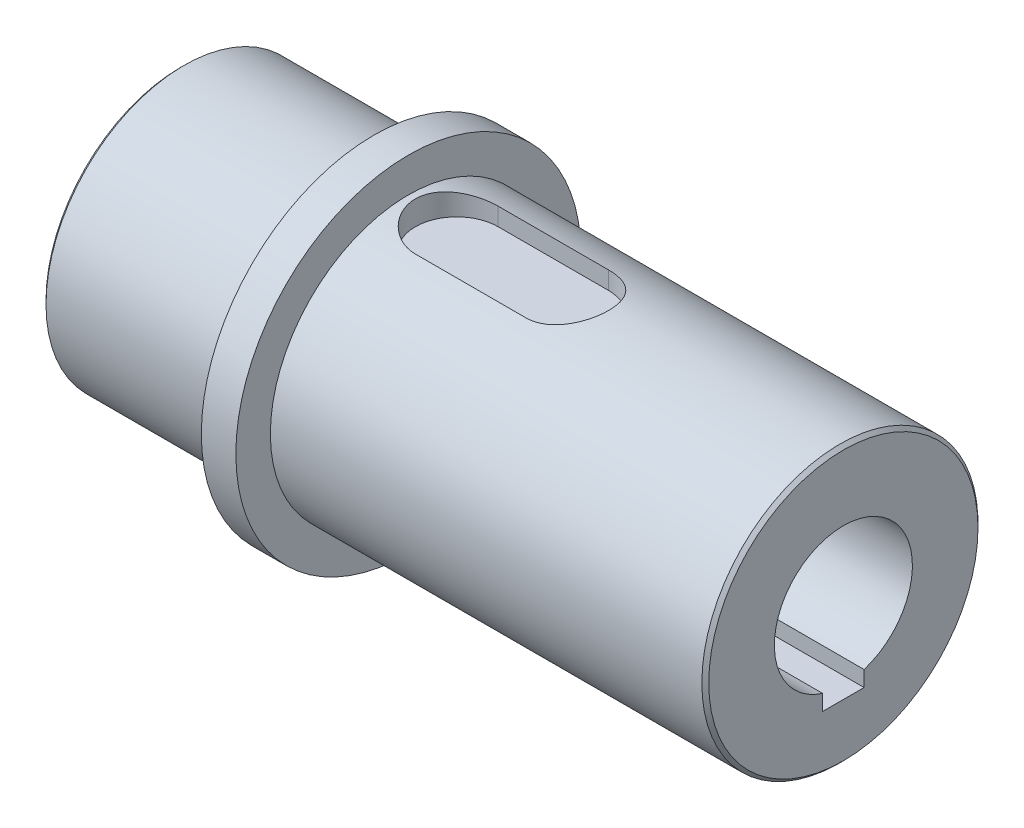
ISO-10303-21;
HEADER;
FILE_DESCRIPTION(('STEP AP214'),'2;1');
FILE_NAME('part.step','',(''),(''),'','','');
FILE_SCHEMA(('AUTOMOTIVE_DESIGN { 1 0 10303 214 1 1 1 1 }'));
ENDSEC;
DATA;
#1=APPLICATION_CONTEXT('core data for automotive mechanical design processes');
#2=APPLICATION_PROTOCOL_DEFINITION('international standard','automotive_design',2000,#1);
#3=PRODUCT_CONTEXT('',#1,'mechanical');
#4=PRODUCT('Part','Part','',(#3));
#5=PRODUCT_RELATED_PRODUCT_CATEGORY('part','',(#4));
#6=PRODUCT_DEFINITION_FORMATION('','',#4);
#7=PRODUCT_DEFINITION_CONTEXT('part definition',#1,'design');
#8=PRODUCT_DEFINITION('design','',#6,#7);
#9=PRODUCT_DEFINITION_SHAPE('','',#8);
#10=(LENGTH_UNIT() NAMED_UNIT(*) SI_UNIT(.MILLI.,.METRE.));
#11=(NAMED_UNIT(*) PLANE_ANGLE_UNIT() SI_UNIT($,.RADIAN.));
#12=(NAMED_UNIT(*) SI_UNIT($,.STERADIAN.) SOLID_ANGLE_UNIT());
#13=UNCERTAINTY_MEASURE_WITH_UNIT(LENGTH_MEASURE(1.E-05),#10,'distance_accuracy_value','');
#14=(GEOMETRIC_REPRESENTATION_CONTEXT(3) GLOBAL_UNCERTAINTY_ASSIGNED_CONTEXT((#13)) GLOBAL_UNIT_ASSIGNED_CONTEXT((#10,
#11,#12)) REPRESENTATION_CONTEXT('',''));
#15=CARTESIAN_POINT('',(0.,0.,0.));
#16=DIRECTION('',(0.,0.,1.));
#17=DIRECTION('',(1.,0.,0.));
#18=AXIS2_PLACEMENT_3D('',#15,#16,#17);
#19=CARTESIAN_POINT('',(96.,0.,0.));
#20=DIRECTION('',(-1.,0.,0.));
#21=DIRECTION('',(0.,0.,1.));
#22=AXIS2_PLACEMENT_3D('',#19,#20,#21);
#23=PLANE('',#22);
#24=CARTESIAN_POINT('',(96.,0.,0.));
#25=DIRECTION('',(-1.,0.,0.));
#26=DIRECTION('',(0.,0.,1.));
#27=AXIS2_PLACEMENT_3D('',#24,#25,#26);
#28=CIRCLE('',#27,10.);
#29=CARTESIAN_POINT('',(96.,-9.53939201416946,3.));
#30=VERTEX_POINT('',#29);
#31=CARTESIAN_POINT('',(96.,-9.53939201416946,-3.));
#32=VERTEX_POINT('',#31);
#33=EDGE_CURVE('E129',#30,#32,#28,.T.);
#34=ORIENTED_EDGE('',*,*,#33,.T.);
#35=DIRECTION('',(0.,-1.,0.));
#36=VECTOR('',#35,1.);
#37=CARTESIAN_POINT('',(96.,-8.71899141751025,-3.));
#38=LINE('',#37,#36);
#39=CARTESIAN_POINT('',(96.,-11.8,-3.));
#40=VERTEX_POINT('',#39);
#41=EDGE_CURVE('E108',#32,#40,#38,.T.);
#42=ORIENTED_EDGE('',*,*,#41,.T.);
#43=DIRECTION('',(0.,0.,1.));
#44=VECTOR('',#43,1.);
#45=CARTESIAN_POINT('',(96.,-11.8,-3.));
#46=LINE('',#45,#44);
#47=CARTESIAN_POINT('',(96.,-11.8,3.));
#48=VERTEX_POINT('',#47);
#49=EDGE_CURVE('E119',#40,#48,#46,.T.);
#50=ORIENTED_EDGE('',*,*,#49,.T.);
#51=DIRECTION('',(0.,1.,0.));
#52=VECTOR('',#51,1.);
#53=CARTESIAN_POINT('',(96.,-8.71899141751025,3.));
#54=LINE('',#53,#52);
#55=EDGE_CURVE('E116',#48,#30,#54,.T.);
#56=ORIENTED_EDGE('',*,*,#55,.T.);
#57=EDGE_LOOP('',(#34,#42,#50,#56));
#58=FACE_BOUND('',#57,.T.);
#59=CARTESIAN_POINT('',(96.,0.,0.));
#60=DIRECTION('',(-1.,0.,0.));
#61=DIRECTION('',(0.,0.,1.));
#62=AXIS2_PLACEMENT_3D('',#59,#60,#61);
#63=CIRCLE('',#62,19.5);
#64=CARTESIAN_POINT('',(96.,0.,19.5));
#65=VERTEX_POINT('',#64);
#66=EDGE_CURVE('E208',#65,#65,#63,.T.);
#67=ORIENTED_EDGE('',*,*,#66,.F.);
#68=EDGE_LOOP('',(#67));
#69=FACE_BOUND('',#68,.T.);
#70=ADVANCED_FACE('F39',(#58,#69),#23,.F.);
#71=CARTESIAN_POINT('',(96.,0.,0.));
#72=DIRECTION('',(-1.,0.,0.));
#73=DIRECTION('',(0.,0.,1.));
#74=AXIS2_PLACEMENT_3D('',#71,#72,#73);
#75=CONICAL_SURFACE('',#74,19.5,0.785398163397448);
#76=CARTESIAN_POINT('',(95.5,0.,0.));
#77=DIRECTION('',(-1.,0.,0.));
#78=DIRECTION('',(0.,0.,1.));
#79=AXIS2_PLACEMENT_3D('',#76,#77,#78);
#80=CIRCLE('',#79,20.);
#81=CARTESIAN_POINT('',(95.5,0.,20.));
#82=VERTEX_POINT('',#81);
#83=EDGE_CURVE('E204',#82,#82,#80,.T.);
#84=ORIENTED_EDGE('',*,*,#83,.F.);
#85=EDGE_LOOP('',(#84));
#86=FACE_BOUND('',#85,.T.);
#87=ORIENTED_EDGE('',*,*,#66,.T.);
#88=EDGE_LOOP('',(#87));
#89=FACE_BOUND('',#88,.T.);
#90=ADVANCED_FACE('F272',(#86,#89),#75,.T.);
#91=CARTESIAN_POINT('',(0.,0.,0.));
#92=DIRECTION('',(-1.,0.,0.));
#93=DIRECTION('',(0.,0.,1.));
#94=AXIS2_PLACEMENT_3D('',#91,#92,#93);
#95=CYLINDRICAL_SURFACE('',#94,20.);
#96=DIRECTION('',(-1.,0.,0.));
#97=VECTOR('',#96,1.);
#98=CARTESIAN_POINT('',(0.,19.0787840283389,-6.));
#99=LINE('',#98,#97);
#100=CARTESIAN_POINT('',(40.,19.0787840283389,-6.));
#101=VERTEX_POINT('',#100);
#102=CARTESIAN_POINT('',(56.,19.0787840283389,-6.));
#103=VERTEX_POINT('',#102);
#104=EDGE_CURVE('E390',#101,#103,#99,.F.);
#105=ORIENTED_EDGE('',*,*,#104,.T.);
#106=CARTESIAN_POINT('',(56.,19.0787840283389,-6.));
#107=CARTESIAN_POINT('',(56.1646679949108,19.0787603919218,-6.00002230630953));
#108=CARTESIAN_POINT('',(56.3293273869304,19.0809150948054,-5.99322212828861));
#109=CARTESIAN_POINT('',(56.6573894283846,19.089408588524,-5.96614198358438));
#110=CARTESIAN_POINT('',(56.8207923520137,19.0957464386677,-5.94586504749983));
#111=CARTESIAN_POINT('',(57.1447667936842,19.1124126760414,-5.89206455668659));
#112=CARTESIAN_POINT('',(57.3053444279638,19.1227309292375,-5.85857463708937));
#113=CARTESIAN_POINT('',(57.6229623086685,19.1470349488515,-5.77865096251378));
#114=CARTESIAN_POINT('',(57.7800024624693,19.1610208111801,-5.73221686903431));
#115=CARTESIAN_POINT('',(58.0893825607235,19.1922338155173,-5.62682620459484));
#116=CARTESIAN_POINT('',(58.2417252187759,19.2094590438083,-5.56787702452553));
#117=CARTESIAN_POINT('',(58.5408741429016,19.2466621419291,-5.43788252899624));
#118=CARTESIAN_POINT('',(58.687678324328,19.2666410353108,-5.36683271334057));
#119=CARTESIAN_POINT('',(58.9747849452531,19.3087849542851,-5.21317247195195));
#120=CARTESIAN_POINT('',(59.1150870185297,19.3309501027959,-5.13056139609833));
#121=CARTESIAN_POINT('',(59.3883877986748,19.3768680311909,-4.95431913401973));
#122=CARTESIAN_POINT('',(59.5213837168722,19.4006214097184,-4.86068378223771));
#123=CARTESIAN_POINT('',(59.7828635732296,19.4497584548899,-4.66024014290223));
#124=CARTESIAN_POINT('',(59.9111151521982,19.4751691904069,-4.5531352636269));
#125=CARTESIAN_POINT('',(60.1582539370087,19.5263015189751,-4.32860344600266));
#126=CARTESIAN_POINT('',(60.2771378666711,19.5520232171847,-4.21117292654718));
#127=CARTESIAN_POINT('',(60.5047413951219,19.6030710031715,-3.96676059198592));
#128=CARTESIAN_POINT('',(60.6134609320288,19.6283970885393,-3.83977871873938));
#129=CARTESIAN_POINT('',(60.8200192544725,19.6779706962222,-3.5770569657621));
#130=CARTESIAN_POINT('',(60.9178581258389,19.7022182270443,-3.44131715512969));
#131=CARTESIAN_POINT('',(61.1039097682599,19.7494715734221,-3.15899953964077));
#132=CARTESIAN_POINT('',(61.1918780463025,19.7724407517412,-3.01225429870654));
#133=CARTESIAN_POINT('',(61.355063794055,19.8159158974823,-2.71155717798052));
#134=CARTESIAN_POINT('',(61.430285978567,19.8364227748921,-2.55760798995096));
#135=CARTESIAN_POINT('',(61.5674164393714,19.8744001644265,-2.24348996032481));
#136=CARTESIAN_POINT('',(61.6293222547682,19.8918701152059,-2.08331997555619));
#137=CARTESIAN_POINT('',(61.7392375024558,19.923254535561,-1.75801430484773));
#138=CARTESIAN_POINT('',(61.7872529399682,19.9371705413066,-1.59288079897389));
#139=CARTESIAN_POINT('',(61.8678255467277,19.960709769643,-1.26354510595574));
#140=CARTESIAN_POINT('',(61.9007806269582,19.9704430293701,-1.09944808925079));
#141=CARTESIAN_POINT('',(61.9528719972864,19.9858966495547,-0.76895215414895));
#142=CARTESIAN_POINT('',(61.9720138041346,19.9916186120195,-0.602554181799297));
#143=CARTESIAN_POINT('',(61.9963199648569,19.9988929276978,-0.268644299740233));
#144=CARTESIAN_POINT('',(62.0014838943061,20.0004451543012,-0.10113235636098));
#145=CARTESIAN_POINT('',(61.9977835949215,19.9993350985708,0.233720900410855));
#146=CARTESIAN_POINT('',(61.9889196235372,19.9966728935831,0.401062216878497));
#147=CARTESIAN_POINT('',(61.9577577883976,19.9873626800314,0.728949940400303));
#148=CARTESIAN_POINT('',(61.9358999900172,19.9808452710305,0.889542117296649));
#149=CARTESIAN_POINT('',(61.8793045182417,19.9641050678088,1.20830021014906));
#150=CARTESIAN_POINT('',(61.8445624577749,19.9538810115069,1.36646528055414));
#151=CARTESIAN_POINT('',(61.7625076983902,19.9300014175933,1.67917461818937));
#152=CARTESIAN_POINT('',(61.7151992242771,19.916347033335,1.83372008335731));
#153=CARTESIAN_POINT('',(61.6083697289368,19.885954581515,2.13828018933734));
#154=CARTESIAN_POINT('',(61.5488441160033,19.8692153547842,2.2882931022387));
#155=CARTESIAN_POINT('',(61.4173094204607,19.8328818557961,2.58443507880941));
#156=CARTESIAN_POINT('',(61.3451671028017,19.8132575095082,2.73050124822119));
#157=CARTESIAN_POINT('',(61.1893768526706,19.7717979578185,3.01609632375419));
#158=CARTESIAN_POINT('',(61.1057249716159,19.7499619943591,3.1556229642424));
#159=CARTESIAN_POINT('',(60.9275130175587,19.704643118031,3.42724384686891));
#160=CARTESIAN_POINT('',(60.8329528185717,19.681160186142,3.55933800314026));
#161=CARTESIAN_POINT('',(60.6335413215712,19.6331439703208,3.81531376455355));
#162=CARTESIAN_POINT('',(60.5286897234991,19.6086106557752,3.93919513006483));
#163=CARTESIAN_POINT('',(60.3051027565368,19.5581593507452,4.18263653591651));
#164=CARTESIAN_POINT('',(60.1859873205257,19.5322244988475,4.30184428600933));
#165=CARTESIAN_POINT('',(59.9381664964976,19.4806179410542,4.52981041510266));
#166=CARTESIAN_POINT('',(59.8094642039191,19.454946153239,4.63857214120815));
#167=CARTESIAN_POINT('',(59.5431596037615,19.4045581786367,4.84504126060965));
#168=CARTESIAN_POINT('',(59.4055514280994,19.3798426394128,4.94274124635232));
#169=CARTESIAN_POINT('',(59.1224409076672,19.3321023379674,5.12628631686323));
#170=CARTESIAN_POINT('',(58.9769416624216,19.3090769201297,5.21213600998877));
#171=CARTESIAN_POINT('',(58.6773648649068,19.2651525602885,5.37223080367566));
#172=CARTESIAN_POINT('',(58.523212921341,19.2442786555291,5.44634371437401));
#173=CARTESIAN_POINT('',(58.2088781586389,19.2055937237889,5.58122691640503));
#174=CARTESIAN_POINT('',(58.0486978375224,19.1877814448102,5.64200266456203));
#175=CARTESIAN_POINT('',(57.7235678816501,19.1557967477957,5.74966145349631));
#176=CARTESIAN_POINT('',(57.5586234734371,19.1416204978023,5.79655912825487));
#177=CARTESIAN_POINT('',(57.225106819549,19.1173543231182,5.87609462586438));
#178=CARTESIAN_POINT('',(57.0565362849515,19.1072625137754,5.90873902604377));
#179=CARTESIAN_POINT('',(56.7400629297635,19.0925703406668,5.95603131732401));
#180=CARTESIAN_POINT('',(56.59245829064,19.0874107715083,5.97251971262425));
#181=CARTESIAN_POINT('',(56.2965728875247,19.0805126306352,5.99450261914156));
#182=CARTESIAN_POINT('',(56.1482934404253,19.0787690288453,6.00001329545508));
#183=CARTESIAN_POINT('',(56.,19.0787840283389,6.));
#184=B_SPLINE_CURVE_WITH_KNOTS('',3,(#106,#107,#108,#109,#110,#111,#112,#113,#114,#115,#116,
#117,#118,#119,#120,#121,#122,#123,#124,#125,#126,#127,#128,#129,#130,#131,#132,#133,#134,#135,
#136,#137,#138,#139,#140,#141,#142,#143,#144,#145,#146,#147,#148,#149,#150,#151,#152,#153,#154,
#155,#156,#157,#158,#159,#160,#161,#162,#163,#164,#165,#166,#167,#168,#169,#170,#171,#172,#173,
#174,#175,#176,#177,#178,#179,#180,#181,#182,#183),.UNSPECIFIED.,.F.,.F.,(4,2,2,2,2,2,2,2,2,2,2,
2,2,2,2,2,2,2,2,2,2,2,2,2,2,2,2,2,2,2,2,2,2,2,2,2,2,2,4),(0.,0.493836284878934,
0.987561555412174,1.48003801924603,1.97252736296405,2.46472666795181,2.95710942192587,
3.44951987503682,3.94211698773,4.44857898474592,4.95521732942466,5.46185875834846,
5.96849619046395,6.48574341264194,7.00279888450885,7.51994982748059,8.03687685551444,
8.53921958328378,9.04136157401788,9.5435188116382,10.0456668334346,10.531706521874,
11.0179118582603,11.5039539397551,11.9901790315928,12.4818885441265,12.9737671698834,
13.4656514771114,13.9575501300996,14.4684682486942,14.9792221093922,15.4903160010787,
16.001210574562,16.517502934493,17.0335836608614,17.549118241575,18.0644146711719,
18.509813123396,18.9545552237083),.UNSPECIFIED.);
#185=CARTESIAN_POINT('',(56.,19.0787840283389,6.));
#186=VERTEX_POINT('',#185);
#187=EDGE_CURVE('E212',#103,#186,#184,.T.);
#188=ORIENTED_EDGE('',*,*,#187,.T.);
#189=DIRECTION('',(-1.,0.,0.));
#190=VECTOR('',#189,1.);
#191=CARTESIAN_POINT('',(0.,19.0787840283389,6.));
#192=LINE('',#191,#190);
#193=CARTESIAN_POINT('',(40.,19.0787840283389,6.));
#194=VERTEX_POINT('',#193);
#195=EDGE_CURVE('E393',#186,#194,#192,.T.);
#196=ORIENTED_EDGE('',*,*,#195,.T.);
#197=CARTESIAN_POINT('',(40.,19.0787840283389,6.));
#198=CARTESIAN_POINT('',(39.8353320050892,19.0787603919218,6.00002230630953));
#199=CARTESIAN_POINT('',(39.6706726130696,19.0809150948054,5.99322212828861));
#200=CARTESIAN_POINT('',(39.3426105716154,19.089408588524,5.96614198358438));
#201=CARTESIAN_POINT('',(39.1792076479863,19.0957464386677,5.94586504749983));
#202=CARTESIAN_POINT('',(38.8552332063158,19.1124126760414,5.89206455668659));
#203=CARTESIAN_POINT('',(38.6946555720362,19.1227309292375,5.85857463708937));
#204=CARTESIAN_POINT('',(38.3770376913315,19.1470349488515,5.77865096251378));
#205=CARTESIAN_POINT('',(38.2199975375307,19.1610208111801,5.73221686903431));
#206=CARTESIAN_POINT('',(37.9106174392765,19.1922338155173,5.62682620459484));
#207=CARTESIAN_POINT('',(37.7582747812241,19.2094590438083,5.56787702452553));
#208=CARTESIAN_POINT('',(37.4591258570984,19.2466621419291,5.43788252899624));
#209=CARTESIAN_POINT('',(37.312321675672,19.2666410353108,5.36683271334057));
#210=CARTESIAN_POINT('',(37.0252150547469,19.3087849542851,5.21317247195195));
#211=CARTESIAN_POINT('',(36.8849129814703,19.3309501027959,5.13056139609832));
#212=CARTESIAN_POINT('',(36.6116122013252,19.3768680311909,4.95431913401973));
#213=CARTESIAN_POINT('',(36.4786162831278,19.4006214097184,4.86068378223771));
#214=CARTESIAN_POINT('',(36.2171364267704,19.4497584548899,4.66024014290223));
#215=CARTESIAN_POINT('',(36.0888848478018,19.4751691904069,4.55313526362689));
#216=CARTESIAN_POINT('',(35.8417460629913,19.5263015189751,4.32860344600266));
#217=CARTESIAN_POINT('',(35.7228621333289,19.5520232171847,4.21117292654718));
#218=CARTESIAN_POINT('',(35.4952586048781,19.6030710031715,3.96676059198591));
#219=CARTESIAN_POINT('',(35.3865390679712,19.6283970885393,3.83977871873938));
#220=CARTESIAN_POINT('',(35.1799807455275,19.6779706962222,3.5770569657621));
#221=CARTESIAN_POINT('',(35.0821418741611,19.7022182270443,3.44131715512969));
#222=CARTESIAN_POINT('',(34.8960902317401,19.7494715734221,3.15899953964077));
#223=CARTESIAN_POINT('',(34.8081219536975,19.7724407517412,3.01225429870653));
#224=CARTESIAN_POINT('',(34.644936205945,19.8159158974823,2.71155717798052));
#225=CARTESIAN_POINT('',(34.569714021433,19.8364227748921,2.55760798995096));
#226=CARTESIAN_POINT('',(34.4325835606286,19.8744001644265,2.24348996032481));
#227=CARTESIAN_POINT('',(34.3706777452318,19.8918701152059,2.08331997555619));
#228=CARTESIAN_POINT('',(34.2607624975442,19.923254535561,1.75801430484773));
#229=CARTESIAN_POINT('',(34.2127470600318,19.9371705413066,1.59288079897389));
#230=CARTESIAN_POINT('',(34.1321744532723,19.960709769643,1.26354510595575));
#231=CARTESIAN_POINT('',(34.0992193730418,19.9704430293701,1.09944808925079));
#232=CARTESIAN_POINT('',(34.0471280027136,19.9858966495547,0.768952154148951));
#233=CARTESIAN_POINT('',(34.0279861958654,19.9916186120195,0.602554181799298));
#234=CARTESIAN_POINT('',(34.0036800351431,19.9988929276978,0.268644299740234));
#235=CARTESIAN_POINT('',(33.9985161056939,20.0004451543012,0.10113235636098));
#236=CARTESIAN_POINT('',(34.0022164050785,19.9993350985708,-0.233720900410854));
#237=CARTESIAN_POINT('',(34.0110803764628,19.9966728935831,-0.401062216878497));
#238=CARTESIAN_POINT('',(34.0422422116024,19.9873626800314,-0.728949940400303));
#239=CARTESIAN_POINT('',(34.0641000099828,19.9808452710305,-0.889542117296649));
#240=CARTESIAN_POINT('',(34.1206954817583,19.9641050678088,-1.20830021014906));
#241=CARTESIAN_POINT('',(34.1554375422251,19.9538810115069,-1.36646528055414));
#242=CARTESIAN_POINT('',(34.2374923016098,19.9300014175933,-1.67917461818937));
#243=CARTESIAN_POINT('',(34.2848007757229,19.916347033335,-1.83372008335731));
#244=CARTESIAN_POINT('',(34.3916302710632,19.885954581515,-2.13828018933734));
#245=CARTESIAN_POINT('',(34.4511558839967,19.8692153547842,-2.2882931022387));
#246=CARTESIAN_POINT('',(34.5826905795393,19.8328818557961,-2.58443507880941));
#247=CARTESIAN_POINT('',(34.6548328971983,19.8132575095082,-2.73050124822119));
#248=CARTESIAN_POINT('',(34.8106231473294,19.7717979578185,-3.01609632375419));
#249=CARTESIAN_POINT('',(34.8942750283841,19.7499619943591,-3.1556229642424));
#250=CARTESIAN_POINT('',(35.0724869824413,19.704643118031,-3.42724384686891));
#251=CARTESIAN_POINT('',(35.1670471814283,19.681160186142,-3.55933800314026));
#252=CARTESIAN_POINT('',(35.3664586784288,19.6331439703208,-3.81531376455355));
#253=CARTESIAN_POINT('',(35.4713102765009,19.6086106557752,-3.93919513006483));
#254=CARTESIAN_POINT('',(35.6948972434632,19.5581593507452,-4.18263653591651));
#255=CARTESIAN_POINT('',(35.8140126794743,19.5322244988475,-4.30184428600933));
#256=CARTESIAN_POINT('',(36.0618335035024,19.4806179410542,-4.52981041510266));
#257=CARTESIAN_POINT('',(36.1905357960809,19.454946153239,-4.63857214120815));
#258=CARTESIAN_POINT('',(36.4568403962385,19.4045581786367,-4.84504126060965));
#259=CARTESIAN_POINT('',(36.5944485719006,19.3798426394128,-4.94274124635232));
#260=CARTESIAN_POINT('',(36.8775590923328,19.3321023379674,-5.12628631686323));
#261=CARTESIAN_POINT('',(37.0230583375784,19.3090769201297,-5.21213600998877));
#262=CARTESIAN_POINT('',(37.3226351350932,19.2651525602885,-5.37223080367566));
#263=CARTESIAN_POINT('',(37.4767870786591,19.2442786555291,-5.44634371437401));
#264=CARTESIAN_POINT('',(37.7911218413611,19.2055937237889,-5.58122691640503));
#265=CARTESIAN_POINT('',(37.9513021624776,19.1877814448102,-5.64200266456203));
#266=CARTESIAN_POINT('',(38.2764321183499,19.1557967477957,-5.74966145349631));
#267=CARTESIAN_POINT('',(38.4413765265628,19.1416204978023,-5.79655912825487));
#268=CARTESIAN_POINT('',(38.774893180451,19.1173543231182,-5.87609462586438));
#269=CARTESIAN_POINT('',(38.9434637150485,19.1072625137754,-5.90873902604377));
#270=CARTESIAN_POINT('',(39.2599370702365,19.0925703406668,-5.95603131732401));
#271=CARTESIAN_POINT('',(39.40754170936,19.0874107715083,-5.97251971262425));
#272=CARTESIAN_POINT('',(39.7034271124753,19.0805126306352,-5.99450261914156));
#273=CARTESIAN_POINT('',(39.8517065595747,19.0787690288453,-6.00001329545508));
#274=CARTESIAN_POINT('',(40.,19.0787840283389,-6.));
#275=B_SPLINE_CURVE_WITH_KNOTS('',3,(#197,#198,#199,#200,#201,#202,#203,#204,#205,#206,#207,
#208,#209,#210,#211,#212,#213,#214,#215,#216,#217,#218,#219,#220,#221,#222,#223,#224,#225,#226,
#227,#228,#229,#230,#231,#232,#233,#234,#235,#236,#237,#238,#239,#240,#241,#242,#243,#244,#245,
#246,#247,#248,#249,#250,#251,#252,#253,#254,#255,#256,#257,#258,#259,#260,#261,#262,#263,#264,
#265,#266,#267,#268,#269,#270,#271,#272,#273,#274),.UNSPECIFIED.,.F.,.F.,(4,2,2,2,2,2,2,2,2,2,2,
2,2,2,2,2,2,2,2,2,2,2,2,2,2,2,2,2,2,2,2,2,2,2,2,2,2,2,4),(0.,0.493836284878934,
0.987561555412174,1.48003801924602,1.97252736296405,2.46472666795181,2.95710942192587,
3.44951987503683,3.94211698773,4.44857898474592,4.95521732942466,5.46185875834846,
5.96849619046395,6.48574341264194,7.00279888450885,7.51994982748059,8.03687685551444,
8.53921958328378,9.04136157401788,9.5435188116382,10.0456668334346,10.531706521874,
11.0179118582603,11.5039539397551,11.9901790315928,12.4818885441265,12.9737671698834,
13.4656514771114,13.9575501300996,14.4684682486942,14.9792221093922,15.4903160010787,
16.001210574562,16.517502934493,17.0335836608614,17.549118241575,18.0644146711719,
18.509813123396,18.9545552237083),.UNSPECIFIED.);
#276=EDGE_CURVE('E62',#194,#101,#275,.T.);
#277=ORIENTED_EDGE('',*,*,#276,.T.);
#278=EDGE_LOOP('',(#105,#188,#196,#277));
#279=FACE_BOUND('',#278,.T.);
#280=CARTESIAN_POINT('',(33.,0.,0.));
#281=DIRECTION('',(-1.,0.,0.));
#282=DIRECTION('',(0.,0.,1.));
#283=AXIS2_PLACEMENT_3D('',#280,#281,#282);
#284=CIRCLE('',#283,20.);
#285=CARTESIAN_POINT('',(33.,0.,20.));
#286=VERTEX_POINT('',#285);
#287=EDGE_CURVE('E200',#286,#286,#284,.T.);
#288=ORIENTED_EDGE('',*,*,#287,.F.);
#289=EDGE_LOOP('',(#288));
#290=FACE_BOUND('',#289,.T.);
#291=ORIENTED_EDGE('',*,*,#83,.T.);
#292=EDGE_LOOP('',(#291));
#293=FACE_BOUND('',#292,.T.);
#294=ADVANCED_FACE('F228',(#279,#290,#293),#95,.T.);
#295=CARTESIAN_POINT('',(33.,0.,-20.));
#296=DIRECTION('',(-1.,0.,0.));
#297=DIRECTION('',(0.,0.,1.));
#298=AXIS2_PLACEMENT_3D('',#295,#296,#297);
#299=PLANE('',#298);
#300=CARTESIAN_POINT('',(33.,0.,0.));
#301=DIRECTION('',(-1.,0.,0.));
#302=DIRECTION('',(0.,0.,1.));
#303=AXIS2_PLACEMENT_3D('',#300,#301,#302);
#304=CIRCLE('',#303,25.);
#305=CARTESIAN_POINT('',(33.,0.,25.));
#306=VERTEX_POINT('',#305);
#307=EDGE_CURVE('E196',#306,#306,#304,.T.);
#308=ORIENTED_EDGE('',*,*,#307,.F.);
#309=EDGE_LOOP('',(#308));
#310=FACE_BOUND('',#309,.T.);
#311=ORIENTED_EDGE('',*,*,#287,.T.);
#312=EDGE_LOOP('',(#311));
#313=FACE_BOUND('',#312,.T.);
#314=ADVANCED_FACE('F265',(#310,#313),#299,.F.);
#315=CARTESIAN_POINT('',(0.,0.,0.));
#316=DIRECTION('',(-1.,0.,0.));
#317=DIRECTION('',(0.,0.,1.));
#318=AXIS2_PLACEMENT_3D('',#315,#316,#317);
#319=CYLINDRICAL_SURFACE('',#318,25.);
#320=CARTESIAN_POINT('',(28.,0.,0.));
#321=DIRECTION('',(-1.,0.,0.));
#322=DIRECTION('',(0.,0.,1.));
#323=AXIS2_PLACEMENT_3D('',#320,#321,#322);
#324=CIRCLE('',#323,25.);
#325=CARTESIAN_POINT('',(28.,0.,25.));
#326=VERTEX_POINT('',#325);
#327=EDGE_CURVE('E192',#326,#326,#324,.T.);
#328=ORIENTED_EDGE('',*,*,#327,.F.);
#329=EDGE_LOOP('',(#328));
#330=FACE_BOUND('',#329,.T.);
#331=ORIENTED_EDGE('',*,*,#307,.T.);
#332=EDGE_LOOP('',(#331));
#333=FACE_BOUND('',#332,.T.);
#334=ADVANCED_FACE('F262',(#330,#333),#319,.T.);
#335=CARTESIAN_POINT('',(28.,0.,-25.));
#336=DIRECTION('',(1.,0.,0.));
#337=DIRECTION('',(0.,0.,-1.));
#338=AXIS2_PLACEMENT_3D('',#335,#336,#337);
#339=PLANE('',#338);
#340=CARTESIAN_POINT('',(28.,0.,0.));
#341=DIRECTION('',(-1.,0.,0.));
#342=DIRECTION('',(0.,0.,1.));
#343=AXIS2_PLACEMENT_3D('',#340,#341,#342);
#344=CIRCLE('',#343,20.);
#345=CARTESIAN_POINT('',(28.,0.,20.));
#346=VERTEX_POINT('',#345);
#347=EDGE_CURVE('E188',#346,#346,#344,.T.);
#348=ORIENTED_EDGE('',*,*,#347,.F.);
#349=EDGE_LOOP('',(#348));
#350=FACE_BOUND('',#349,.T.);
#351=ORIENTED_EDGE('',*,*,#327,.T.);
#352=EDGE_LOOP('',(#351));
#353=FACE_BOUND('',#352,.T.);
#354=ADVANCED_FACE('F258',(#350,#353),#339,.F.);
#355=CARTESIAN_POINT('',(0.,0.,0.));
#356=DIRECTION('',(-1.,0.,0.));
#357=DIRECTION('',(0.,0.,1.));
#358=AXIS2_PLACEMENT_3D('',#355,#356,#357);
#359=CYLINDRICAL_SURFACE('',#358,20.);
#360=CARTESIAN_POINT('',(0.500000000000001,0.,0.));
#361=DIRECTION('',(-1.,0.,0.));
#362=DIRECTION('',(0.,0.,1.));
#363=AXIS2_PLACEMENT_3D('',#360,#361,#362);
#364=CIRCLE('',#363,20.);
#365=CARTESIAN_POINT('',(0.500000000000001,0.,20.));
#366=VERTEX_POINT('',#365);
#367=EDGE_CURVE('E184',#366,#366,#364,.T.);
#368=ORIENTED_EDGE('',*,*,#367,.F.);
#369=EDGE_LOOP('',(#368));
#370=FACE_BOUND('',#369,.T.);
#371=ORIENTED_EDGE('',*,*,#347,.T.);
#372=EDGE_LOOP('',(#371));
#373=FACE_BOUND('',#372,.T.);
#374=ADVANCED_FACE('F254',(#370,#373),#359,.T.);
#375=CARTESIAN_POINT('',(0.500000000000001,0.,0.));
#376=DIRECTION('',(1.,0.,0.));
#377=DIRECTION('',(0.,0.,-1.));
#378=AXIS2_PLACEMENT_3D('',#375,#376,#377);
#379=CONICAL_SURFACE('',#378,20.,0.785398163397449);
#380=CARTESIAN_POINT('',(0.,0.,0.));
#381=DIRECTION('',(-1.,0.,0.));
#382=DIRECTION('',(0.,0.,1.));
#383=AXIS2_PLACEMENT_3D('',#380,#381,#382);
#384=CIRCLE('',#383,19.5);
#385=CARTESIAN_POINT('',(0.,0.,19.5));
#386=VERTEX_POINT('',#385);
#387=EDGE_CURVE('E170',#386,#386,#384,.T.);
#388=ORIENTED_EDGE('',*,*,#387,.F.);
#389=EDGE_LOOP('',(#388));
#390=FACE_BOUND('',#389,.T.);
#391=ORIENTED_EDGE('',*,*,#367,.T.);
#392=EDGE_LOOP('',(#391));
#393=FACE_BOUND('',#392,.T.);
#394=ADVANCED_FACE('F250',(#390,#393),#379,.T.);
#395=CARTESIAN_POINT('',(0.,0.,-19.5));
#396=DIRECTION('',(1.,0.,0.));
#397=DIRECTION('',(0.,0.,-1.));
#398=AXIS2_PLACEMENT_3D('',#395,#396,#397);
#399=PLANE('',#398);
#400=DIRECTION('',(0.,0.,1.));
#401=VECTOR('',#400,1.);
#402=CARTESIAN_POINT('',(0.,-11.8,-3.));
#403=LINE('',#402,#401);
#404=CARTESIAN_POINT('',(0.,-11.8,-3.));
#405=VERTEX_POINT('',#404);
#406=CARTESIAN_POINT('',(0.,-11.8,3.));
#407=VERTEX_POINT('',#406);
#408=EDGE_CURVE('E133',#405,#407,#403,.T.);
#409=ORIENTED_EDGE('',*,*,#408,.F.);
#410=DIRECTION('',(0.,-1.,0.));
#411=VECTOR('',#410,1.);
#412=CARTESIAN_POINT('',(0.,-8.71899141751025,-3.));
#413=LINE('',#412,#411);
#414=CARTESIAN_POINT('',(0.,-9.53939201416946,-3.));
#415=VERTEX_POINT('',#414);
#416=EDGE_CURVE('E110',#415,#405,#413,.T.);
#417=ORIENTED_EDGE('',*,*,#416,.F.);
#418=CARTESIAN_POINT('',(0.,0.,0.));
#419=DIRECTION('',(-1.,0.,0.));
#420=DIRECTION('',(0.,0.,1.));
#421=AXIS2_PLACEMENT_3D('',#418,#419,#420);
#422=CIRCLE('',#421,10.);
#423=CARTESIAN_POINT('',(0.,-9.53939201416946,3.));
#424=VERTEX_POINT('',#423);
#425=EDGE_CURVE('E143',#424,#415,#422,.T.);
#426=ORIENTED_EDGE('',*,*,#425,.F.);
#427=DIRECTION('',(0.,1.,0.));
#428=VECTOR('',#427,1.);
#429=CARTESIAN_POINT('',(0.,-8.71899141751025,3.));
#430=LINE('',#429,#428);
#431=EDGE_CURVE('E54',#407,#424,#430,.T.);
#432=ORIENTED_EDGE('',*,*,#431,.F.);
#433=EDGE_LOOP('',(#409,#417,#426,#432));
#434=FACE_BOUND('',#433,.T.);
#435=ORIENTED_EDGE('',*,*,#387,.T.);
#436=EDGE_LOOP('',(#435));
#437=FACE_BOUND('',#436,.T.);
#438=ADVANCED_FACE('F247',(#434,#437),#399,.F.);
#439=CARTESIAN_POINT('',(40.,16.5,0.));
#440=DIRECTION('',(0.,1.,0.));
#441=DIRECTION('',(0.,0.,1.));
#442=AXIS2_PLACEMENT_3D('',#439,#440,#441);
#443=CYLINDRICAL_SURFACE('',#442,6.);
#444=DIRECTION('',(0.,1.,0.));
#445=VECTOR('',#444,1.);
#446=CARTESIAN_POINT('',(40.,16.5,6.));
#447=LINE('',#446,#445);
#448=CARTESIAN_POINT('',(40.,16.5,6.));
#449=VERTEX_POINT('',#448);
#450=EDGE_CURVE('E166',#449,#194,#447,.T.);
#451=ORIENTED_EDGE('',*,*,#450,.F.);
#452=CARTESIAN_POINT('',(40.,16.5,0.));
#453=DIRECTION('',(0.,1.,0.));
#454=DIRECTION('',(0.,0.,1.));
#455=AXIS2_PLACEMENT_3D('',#452,#453,#454);
#456=CIRCLE('',#455,6.);
#457=CARTESIAN_POINT('',(40.,16.5,-6.));
#458=VERTEX_POINT('',#457);
#459=EDGE_CURVE('E147',#458,#449,#456,.T.);
#460=ORIENTED_EDGE('',*,*,#459,.F.);
#461=DIRECTION('',(0.,1.,0.));
#462=VECTOR('',#461,1.);
#463=CARTESIAN_POINT('',(40.,16.5,-6.));
#464=LINE('',#463,#462);
#465=EDGE_CURVE('E167',#458,#101,#464,.T.);
#466=ORIENTED_EDGE('',*,*,#465,.T.);
#467=ORIENTED_EDGE('',*,*,#276,.F.);
#468=EDGE_LOOP('',(#451,#460,#466,#467));
#469=FACE_BOUND('',#468,.T.);
#470=ADVANCED_FACE('F243',(#469),#443,.F.);
#471=CARTESIAN_POINT('',(40.,16.5,-6.));
#472=DIRECTION('',(0.,0.,-1.));
#473=DIRECTION('',(-1.,0.,0.));
#474=AXIS2_PLACEMENT_3D('',#471,#472,#473);
#475=PLANE('',#474);
#476=ORIENTED_EDGE('',*,*,#465,.F.);
#477=DIRECTION('',(-1.,0.,0.));
#478=VECTOR('',#477,1.);
#479=CARTESIAN_POINT('',(40.,16.5,-6.));
#480=LINE('',#479,#478);
#481=CARTESIAN_POINT('',(56.,16.5,-6.));
#482=VERTEX_POINT('',#481);
#483=EDGE_CURVE('E162',#482,#458,#480,.T.);
#484=ORIENTED_EDGE('',*,*,#483,.F.);
#485=DIRECTION('',(0.,1.,0.));
#486=VECTOR('',#485,1.);
#487=CARTESIAN_POINT('',(56.,16.5,-6.));
#488=LINE('',#487,#486);
#489=EDGE_CURVE('E171',#482,#103,#488,.T.);
#490=ORIENTED_EDGE('',*,*,#489,.T.);
#491=ORIENTED_EDGE('',*,*,#104,.F.);
#492=EDGE_LOOP('',(#476,#484,#490,#491));
#493=FACE_BOUND('',#492,.T.);
#494=ADVANCED_FACE('F237',(#493),#475,.F.);
#495=CARTESIAN_POINT('',(56.,16.5,0.));
#496=DIRECTION('',(0.,1.,0.));
#497=DIRECTION('',(0.,0.,1.));
#498=AXIS2_PLACEMENT_3D('',#495,#496,#497);
#499=CYLINDRICAL_SURFACE('',#498,6.);
#500=ORIENTED_EDGE('',*,*,#489,.F.);
#501=CARTESIAN_POINT('',(56.,16.5,0.));
#502=DIRECTION('',(0.,1.,0.));
#503=DIRECTION('',(0.,0.,1.));
#504=AXIS2_PLACEMENT_3D('',#501,#502,#503);
#505=CIRCLE('',#504,6.);
#506=CARTESIAN_POINT('',(56.,16.5,6.));
#507=VERTEX_POINT('',#506);
#508=EDGE_CURVE('E158',#507,#482,#505,.T.);
#509=ORIENTED_EDGE('',*,*,#508,.F.);
#510=DIRECTION('',(0.,1.,0.));
#511=VECTOR('',#510,1.);
#512=CARTESIAN_POINT('',(56.,16.5,6.));
#513=LINE('',#512,#511);
#514=EDGE_CURVE('E175',#507,#186,#513,.T.);
#515=ORIENTED_EDGE('',*,*,#514,.T.);
#516=ORIENTED_EDGE('',*,*,#187,.F.);
#517=EDGE_LOOP('',(#500,#509,#515,#516));
#518=FACE_BOUND('',#517,.T.);
#519=ADVANCED_FACE('F231',(#518),#499,.F.);
#520=CARTESIAN_POINT('',(40.,16.5,6.));
#521=DIRECTION('',(0.,0.,1.));
#522=DIRECTION('',(1.,0.,0.));
#523=AXIS2_PLACEMENT_3D('',#520,#521,#522);
#524=PLANE('',#523);
#525=ORIENTED_EDGE('',*,*,#514,.F.);
#526=DIRECTION('',(1.,0.,0.));
#527=VECTOR('',#526,1.);
#528=CARTESIAN_POINT('',(40.,16.5,6.));
#529=LINE('',#528,#527);
#530=EDGE_CURVE('E154',#449,#507,#529,.T.);
#531=ORIENTED_EDGE('',*,*,#530,.F.);
#532=ORIENTED_EDGE('',*,*,#450,.T.);
#533=ORIENTED_EDGE('',*,*,#195,.F.);
#534=EDGE_LOOP('',(#525,#531,#532,#533));
#535=FACE_BOUND('',#534,.T.);
#536=ADVANCED_FACE('F236',(#535),#524,.F.);
#537=CARTESIAN_POINT('',(40.,16.5,0.));
#538=DIRECTION('',(0.,1.,0.));
#539=DIRECTION('',(0.,0.,1.));
#540=AXIS2_PLACEMENT_3D('',#537,#538,#539);
#541=PLANE('',#540);
#542=ORIENTED_EDGE('',*,*,#459,.T.);
#543=ORIENTED_EDGE('',*,*,#530,.T.);
#544=ORIENTED_EDGE('',*,*,#508,.T.);
#545=ORIENTED_EDGE('',*,*,#483,.T.);
#546=EDGE_LOOP('',(#542,#543,#544,#545));
#547=FACE_BOUND('',#546,.T.);
#548=ADVANCED_FACE('F241',(#547),#541,.T.);
#549=CARTESIAN_POINT('',(96.,0.,0.));
#550=DIRECTION('',(-1.,0.,0.));
#551=DIRECTION('',(0.,0.,1.));
#552=AXIS2_PLACEMENT_3D('',#549,#550,#551);
#553=CYLINDRICAL_SURFACE('',#552,10.);
#554=ORIENTED_EDGE('',*,*,#425,.T.);
#555=DIRECTION('',(-1.,0.,0.));
#556=VECTOR('',#555,1.);
#557=CARTESIAN_POINT('',(96.,-9.53939201416946,-3.));
#558=LINE('',#557,#556);
#559=EDGE_CURVE('E11',#415,#32,#558,.F.);
#560=ORIENTED_EDGE('',*,*,#559,.T.);
#561=ORIENTED_EDGE('',*,*,#33,.F.);
#562=DIRECTION('',(-1.,0.,0.));
#563=VECTOR('',#562,1.);
#564=CARTESIAN_POINT('',(96.,-9.53939201416946,3.));
#565=LINE('',#564,#563);
#566=EDGE_CURVE('E47',#30,#424,#565,.T.);
#567=ORIENTED_EDGE('',*,*,#566,.T.);
#568=EDGE_LOOP('',(#554,#560,#561,#567));
#569=FACE_BOUND('',#568,.T.);
#570=ADVANCED_FACE('F331',(#569),#553,.F.);
#571=CARTESIAN_POINT('',(96.,-8.71899141751025,-3.));
#572=DIRECTION('',(0.,0.,-1.));
#573=DIRECTION('',(0.,1.,0.));
#574=AXIS2_PLACEMENT_3D('',#571,#572,#573);
#575=PLANE('',#574);
#576=ORIENTED_EDGE('',*,*,#416,.T.);
#577=DIRECTION('',(-1.,0.,0.));
#578=VECTOR('',#577,1.);
#579=CARTESIAN_POINT('',(96.,-11.8,-3.));
#580=LINE('',#579,#578);
#581=EDGE_CURVE('E104',#40,#405,#580,.T.);
#582=ORIENTED_EDGE('',*,*,#581,.F.);
#583=ORIENTED_EDGE('',*,*,#41,.F.);
#584=ORIENTED_EDGE('',*,*,#559,.F.);
#585=EDGE_LOOP('',(#576,#582,#583,#584));
#586=FACE_BOUND('',#585,.T.);
#587=ADVANCED_FACE('F106',(#586),#575,.F.);
#588=CARTESIAN_POINT('',(96.,-8.71899141751025,3.));
#589=DIRECTION('',(0.,0.,1.));
#590=DIRECTION('',(0.,-1.,0.));
#591=AXIS2_PLACEMENT_3D('',#588,#589,#590);
#592=PLANE('',#591);
#593=ORIENTED_EDGE('',*,*,#55,.F.);
#594=DIRECTION('',(-1.,0.,0.));
#595=VECTOR('',#594,1.);
#596=CARTESIAN_POINT('',(96.,-11.8,3.));
#597=LINE('',#596,#595);
#598=EDGE_CURVE('E115',#48,#407,#597,.T.);
#599=ORIENTED_EDGE('',*,*,#598,.T.);
#600=ORIENTED_EDGE('',*,*,#431,.T.);
#601=ORIENTED_EDGE('',*,*,#566,.F.);
#602=EDGE_LOOP('',(#593,#599,#600,#601));
#603=FACE_BOUND('',#602,.T.);
#604=ADVANCED_FACE('F359',(#603),#592,.F.);
#605=CARTESIAN_POINT('',(96.,-11.8,-3.));
#606=DIRECTION('',(0.,-1.,0.));
#607=DIRECTION('',(0.,0.,-1.));
#608=AXIS2_PLACEMENT_3D('',#605,#606,#607);
#609=PLANE('',#608);
#610=ORIENTED_EDGE('',*,*,#408,.T.);
#611=ORIENTED_EDGE('',*,*,#598,.F.);
#612=ORIENTED_EDGE('',*,*,#49,.F.);
#613=ORIENTED_EDGE('',*,*,#581,.T.);
#614=EDGE_LOOP('',(#610,#611,#612,#613));
#615=FACE_BOUND('',#614,.T.);
#616=ADVANCED_FACE('F120',(#615),#609,.F.);
#617=CLOSED_SHELL('',(#70,#90,#294,#314,#334,#354,#374,#394,#438,#470,#494,#519,#536,#548,#570,
#587,#604,#616));
#618=MANIFOLD_SOLID_BREP('B2',#617);
#619=ADVANCED_BREP_SHAPE_REPRESENTATION('',(#18,#618),#14);
#620=SHAPE_DEFINITION_REPRESENTATION(#9,#619);
ENDSEC;
END-ISO-10303-21;
